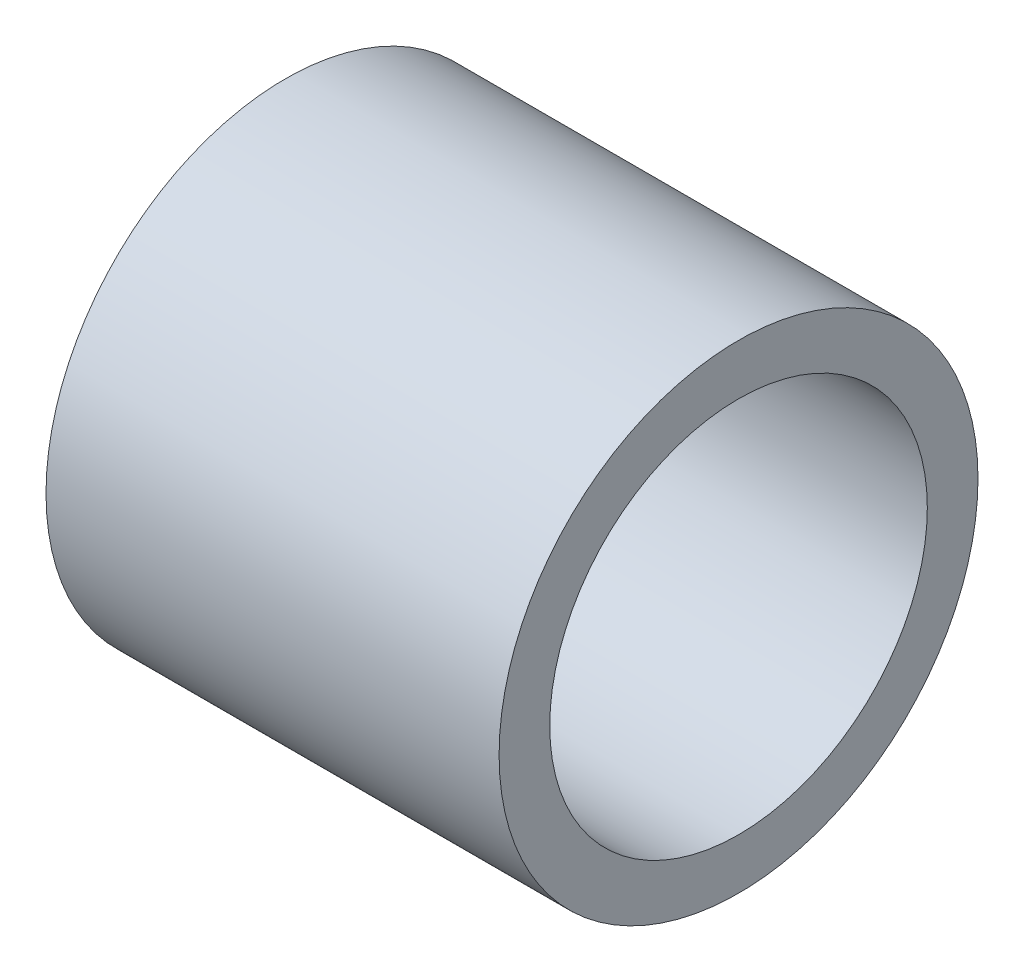
ISO-10303-21;
HEADER;
FILE_DESCRIPTION(('STEP AP214'),'2;1');
FILE_NAME('part.step','',(''),(''),'','','');
FILE_SCHEMA(('AUTOMOTIVE_DESIGN { 1 0 10303 214 1 1 1 1 }'));
ENDSEC;
DATA;
#1=APPLICATION_CONTEXT('core data for automotive mechanical design processes');
#2=APPLICATION_PROTOCOL_DEFINITION('international standard','automotive_design',2000,#1);
#3=PRODUCT_CONTEXT('',#1,'mechanical');
#4=PRODUCT('Part','Part','',(#3));
#5=PRODUCT_RELATED_PRODUCT_CATEGORY('part','',(#4));
#6=PRODUCT_DEFINITION_FORMATION('','',#4);
#7=PRODUCT_DEFINITION_CONTEXT('part definition',#1,'design');
#8=PRODUCT_DEFINITION('design','',#6,#7);
#9=PRODUCT_DEFINITION_SHAPE('','',#8);
#10=(LENGTH_UNIT() NAMED_UNIT(*) SI_UNIT(.MILLI.,.METRE.));
#11=(NAMED_UNIT(*) PLANE_ANGLE_UNIT() SI_UNIT($,.RADIAN.));
#12=(NAMED_UNIT(*) SI_UNIT($,.STERADIAN.) SOLID_ANGLE_UNIT());
#13=UNCERTAINTY_MEASURE_WITH_UNIT(LENGTH_MEASURE(1.E-05),#10,'distance_accuracy_value','');
#14=(GEOMETRIC_REPRESENTATION_CONTEXT(3) GLOBAL_UNCERTAINTY_ASSIGNED_CONTEXT((#13)) GLOBAL_UNIT_ASSIGNED_CONTEXT((#10,
#11,#12)) REPRESENTATION_CONTEXT('',''));
#15=CARTESIAN_POINT('',(0.,0.,0.));
#16=DIRECTION('',(0.,0.,1.));
#17=DIRECTION('',(1.,0.,0.));
#18=AXIS2_PLACEMENT_3D('',#15,#16,#17);
#19=CARTESIAN_POINT('',(22.86,0.,0.));
#20=DIRECTION('',(1.,0.,0.));
#21=DIRECTION('',(0.,0.,-1.));
#22=AXIS2_PLACEMENT_3D('',#19,#20,#21);
#23=PLANE('',#22);
#24=CARTESIAN_POINT('',(22.86,0.,0.));
#25=DIRECTION('',(1.,0.,0.));
#26=DIRECTION('',(0.,0.,-1.));
#27=AXIS2_PLACEMENT_3D('',#24,#25,#26);
#28=CIRCLE('',#27,12.0815688658632);
#29=CARTESIAN_POINT('',(22.86,0.,-12.0815688658632));
#30=VERTEX_POINT('',#29);
#31=EDGE_CURVE('E10',#30,#30,#28,.T.);
#32=ORIENTED_EDGE('',*,*,#31,.T.);
#33=EDGE_LOOP('',(#32));
#34=FACE_BOUND('',#33,.T.);
#35=CARTESIAN_POINT('',(22.86,0.,0.));
#36=DIRECTION('',(1.,0.,0.));
#37=DIRECTION('',(0.,0.,-1.));
#38=AXIS2_PLACEMENT_3D('',#35,#36,#37);
#39=CIRCLE('',#38,9.525);
#40=CARTESIAN_POINT('',(22.86,0.,-9.525));
#41=VERTEX_POINT('',#40);
#42=EDGE_CURVE('E44',#41,#41,#39,.T.);
#43=ORIENTED_EDGE('',*,*,#42,.F.);
#44=EDGE_LOOP('',(#43));
#45=FACE_BOUND('',#44,.T.);
#46=ADVANCED_FACE('F33',(#34,#45),#23,.T.);
#47=CARTESIAN_POINT('',(0.,0.,0.));
#48=DIRECTION('',(1.,0.,0.));
#49=DIRECTION('',(0.,0.,-1.));
#50=AXIS2_PLACEMENT_3D('',#47,#48,#49);
#51=PLANE('',#50);
#52=CARTESIAN_POINT('',(0.,0.,0.));
#53=DIRECTION('',(1.,0.,0.));
#54=DIRECTION('',(0.,0.,-1.));
#55=AXIS2_PLACEMENT_3D('',#52,#53,#54);
#56=CIRCLE('',#55,12.0815688658632);
#57=CARTESIAN_POINT('',(0.,0.,-12.0815688658632));
#58=VERTEX_POINT('',#57);
#59=EDGE_CURVE('E37',#58,#58,#56,.T.);
#60=ORIENTED_EDGE('',*,*,#59,.F.);
#61=EDGE_LOOP('',(#60));
#62=FACE_BOUND('',#61,.T.);
#63=CARTESIAN_POINT('',(0.,0.,0.));
#64=DIRECTION('',(1.,0.,0.));
#65=DIRECTION('',(0.,0.,-1.));
#66=AXIS2_PLACEMENT_3D('',#63,#64,#65);
#67=CIRCLE('',#66,9.525);
#68=CARTESIAN_POINT('',(0.,0.,-9.525));
#69=VERTEX_POINT('',#68);
#70=EDGE_CURVE('E46',#69,#69,#67,.T.);
#71=ORIENTED_EDGE('',*,*,#70,.T.);
#72=EDGE_LOOP('',(#71));
#73=FACE_BOUND('',#72,.T.);
#74=ADVANCED_FACE('F56',(#62,#73),#51,.F.);
#75=CARTESIAN_POINT('',(22.86,0.,0.));
#76=DIRECTION('',(-1.,0.,0.));
#77=DIRECTION('',(0.,0.,1.));
#78=AXIS2_PLACEMENT_3D('',#75,#76,#77);
#79=CYLINDRICAL_SURFACE('',#78,12.0815688658632);
#80=ORIENTED_EDGE('',*,*,#31,.F.);
#81=EDGE_LOOP('',(#80));
#82=FACE_BOUND('',#81,.T.);
#83=ORIENTED_EDGE('',*,*,#59,.T.);
#84=EDGE_LOOP('',(#83));
#85=FACE_BOUND('',#84,.T.);
#86=ADVANCED_FACE('F35',(#82,#85),#79,.T.);
#87=CARTESIAN_POINT('',(22.86,0.,0.));
#88=DIRECTION('',(-1.,0.,0.));
#89=DIRECTION('',(0.,0.,1.));
#90=AXIS2_PLACEMENT_3D('',#87,#88,#89);
#91=CYLINDRICAL_SURFACE('',#90,9.525);
#92=ORIENTED_EDGE('',*,*,#42,.T.);
#93=EDGE_LOOP('',(#92));
#94=FACE_BOUND('',#93,.T.);
#95=ORIENTED_EDGE('',*,*,#70,.F.);
#96=EDGE_LOOP('',(#95));
#97=FACE_BOUND('',#96,.T.);
#98=ADVANCED_FACE('F52',(#94,#97),#91,.F.);
#99=CLOSED_SHELL('',(#46,#74,#86,#98));
#100=MANIFOLD_SOLID_BREP('B2',#99);
#101=ADVANCED_BREP_SHAPE_REPRESENTATION('',(#18,#100),#14);
#102=SHAPE_DEFINITION_REPRESENTATION(#9,#101);
ENDSEC;
END-ISO-10303-21;
